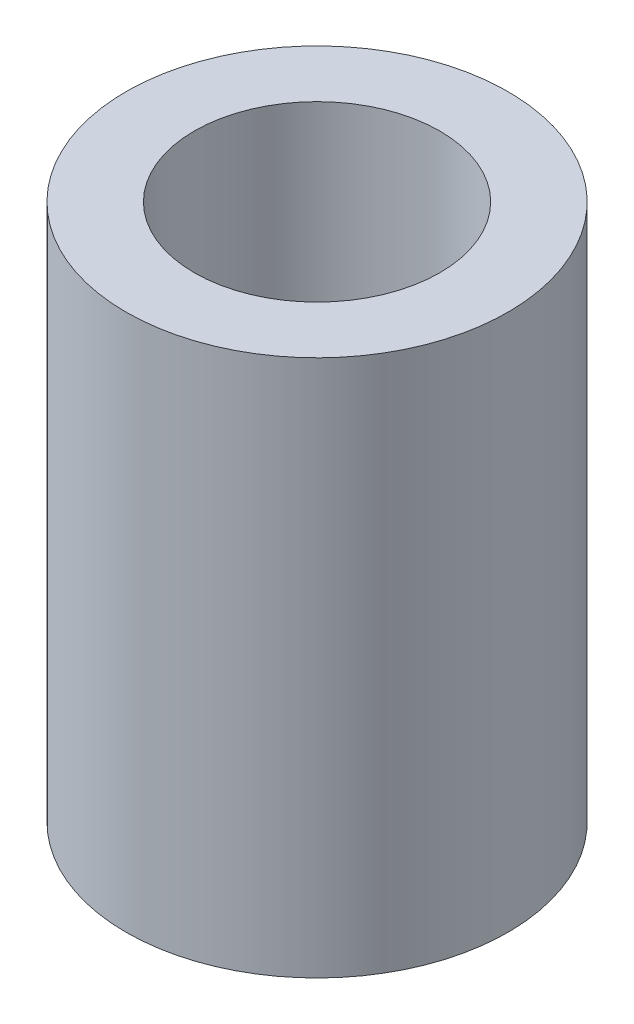
ISO-10303-21;
HEADER;
FILE_DESCRIPTION(('STEP AP214'),'2;1');
FILE_NAME('part.step','',(''),(''),'','','');
FILE_SCHEMA(('AUTOMOTIVE_DESIGN { 1 0 10303 214 1 1 1 1 }'));
ENDSEC;
DATA;
#1=APPLICATION_CONTEXT('core data for automotive mechanical design processes');
#2=APPLICATION_PROTOCOL_DEFINITION('international standard','automotive_design',2000,#1);
#3=PRODUCT_CONTEXT('',#1,'mechanical');
#4=PRODUCT('Part','Part','',(#3));
#5=PRODUCT_RELATED_PRODUCT_CATEGORY('part','',(#4));
#6=PRODUCT_DEFINITION_FORMATION('','',#4);
#7=PRODUCT_DEFINITION_CONTEXT('part definition',#1,'design');
#8=PRODUCT_DEFINITION('design','',#6,#7);
#9=PRODUCT_DEFINITION_SHAPE('','',#8);
#10=(LENGTH_UNIT() NAMED_UNIT(*) SI_UNIT(.MILLI.,.METRE.));
#11=(NAMED_UNIT(*) PLANE_ANGLE_UNIT() SI_UNIT($,.RADIAN.));
#12=(NAMED_UNIT(*) SI_UNIT($,.STERADIAN.) SOLID_ANGLE_UNIT());
#13=UNCERTAINTY_MEASURE_WITH_UNIT(LENGTH_MEASURE(1.E-05),#10,'distance_accuracy_value','');
#14=(GEOMETRIC_REPRESENTATION_CONTEXT(3) GLOBAL_UNCERTAINTY_ASSIGNED_CONTEXT((#13)) GLOBAL_UNIT_ASSIGNED_CONTEXT((#10,
#11,#12)) REPRESENTATION_CONTEXT('',''));
#15=CARTESIAN_POINT('',(0.,0.,0.));
#16=DIRECTION('',(0.,0.,1.));
#17=DIRECTION('',(1.,0.,0.));
#18=AXIS2_PLACEMENT_3D('',#15,#16,#17);
#19=CARTESIAN_POINT('',(0.,10.,0.));
#20=DIRECTION('',(0.,-1.,0.));
#21=DIRECTION('',(0.,0.,-1.));
#22=AXIS2_PLACEMENT_3D('',#19,#20,#21);
#23=CYLINDRICAL_SURFACE('',#22,3.556);
#24=CARTESIAN_POINT('',(0.,10.,0.));
#25=DIRECTION('',(0.,1.,0.));
#26=DIRECTION('',(0.,0.,1.));
#27=AXIS2_PLACEMENT_3D('',#24,#25,#26);
#28=CIRCLE('',#27,3.556);
#29=CARTESIAN_POINT('',(0.,10.,3.556));
#30=VERTEX_POINT('',#29);
#31=EDGE_CURVE('E10',#30,#30,#28,.T.);
#32=ORIENTED_EDGE('',*,*,#31,.F.);
#33=EDGE_LOOP('',(#32));
#34=FACE_BOUND('',#33,.T.);
#35=CARTESIAN_POINT('',(0.,0.,0.));
#36=DIRECTION('',(0.,1.,0.));
#37=DIRECTION('',(0.,0.,1.));
#38=AXIS2_PLACEMENT_3D('',#35,#36,#37);
#39=CIRCLE('',#38,3.556);
#40=CARTESIAN_POINT('',(0.,0.,3.556));
#41=VERTEX_POINT('',#40);
#42=EDGE_CURVE('E34',#41,#41,#39,.T.);
#43=ORIENTED_EDGE('',*,*,#42,.T.);
#44=EDGE_LOOP('',(#43));
#45=FACE_BOUND('',#44,.T.);
#46=ADVANCED_FACE('F31',(#34,#45),#23,.T.);
#47=CARTESIAN_POINT('',(0.,10.,0.));
#48=DIRECTION('',(0.,1.,0.));
#49=DIRECTION('',(0.,0.,1.));
#50=AXIS2_PLACEMENT_3D('',#47,#48,#49);
#51=PLANE('',#50);
#52=CARTESIAN_POINT('',(0.,10.,0.));
#53=DIRECTION('',(0.,1.,0.));
#54=DIRECTION('',(0.,0.,1.));
#55=AXIS2_PLACEMENT_3D('',#52,#53,#54);
#56=CIRCLE('',#55,2.286);
#57=CARTESIAN_POINT('',(0.,10.,2.286));
#58=VERTEX_POINT('',#57);
#59=EDGE_CURVE('E43',#58,#58,#56,.T.);
#60=ORIENTED_EDGE('',*,*,#59,.F.);
#61=EDGE_LOOP('',(#60));
#62=FACE_BOUND('',#61,.T.);
#63=ORIENTED_EDGE('',*,*,#31,.T.);
#64=EDGE_LOOP('',(#63));
#65=FACE_BOUND('',#64,.T.);
#66=ADVANCED_FACE('F58',(#62,#65),#51,.T.);
#67=CARTESIAN_POINT('',(0.,0.,0.));
#68=DIRECTION('',(0.,1.,0.));
#69=DIRECTION('',(0.,0.,1.));
#70=AXIS2_PLACEMENT_3D('',#67,#68,#69);
#71=PLANE('',#70);
#72=ORIENTED_EDGE('',*,*,#42,.F.);
#73=EDGE_LOOP('',(#72));
#74=FACE_BOUND('',#73,.T.);
#75=ADVANCED_FACE('F54',(#74),#71,.F.);
#76=CARTESIAN_POINT('',(0.,2.5,0.));
#77=DIRECTION('',(0.,1.,0.));
#78=DIRECTION('',(0.,0.,1.));
#79=AXIS2_PLACEMENT_3D('',#76,#77,#78);
#80=CYLINDRICAL_SURFACE('',#79,2.286);
#81=CARTESIAN_POINT('',(0.,2.5,0.));
#82=DIRECTION('',(0.,1.,0.));
#83=DIRECTION('',(0.,0.,1.));
#84=AXIS2_PLACEMENT_3D('',#81,#82,#83);
#85=CIRCLE('',#84,2.286);
#86=CARTESIAN_POINT('',(0.,2.5,2.286));
#87=VERTEX_POINT('',#86);
#88=EDGE_CURVE('E41',#87,#87,#85,.T.);
#89=ORIENTED_EDGE('',*,*,#88,.F.);
#90=EDGE_LOOP('',(#89));
#91=FACE_BOUND('',#90,.T.);
#92=ORIENTED_EDGE('',*,*,#59,.T.);
#93=EDGE_LOOP('',(#92));
#94=FACE_BOUND('',#93,.T.);
#95=ADVANCED_FACE('F51',(#91,#94),#80,.F.);
#96=CARTESIAN_POINT('',(0.,2.5,0.));
#97=DIRECTION('',(0.,1.,0.));
#98=DIRECTION('',(0.,0.,1.));
#99=AXIS2_PLACEMENT_3D('',#96,#97,#98);
#100=PLANE('',#99);
#101=ORIENTED_EDGE('',*,*,#88,.T.);
#102=EDGE_LOOP('',(#101));
#103=FACE_BOUND('',#102,.T.);
#104=ADVANCED_FACE('F49',(#103),#100,.T.);
#105=CLOSED_SHELL('',(#46,#66,#75,#95,#104));
#106=MANIFOLD_SOLID_BREP('B2',#105);
#107=ADVANCED_BREP_SHAPE_REPRESENTATION('',(#18,#106),#14);
#108=SHAPE_DEFINITION_REPRESENTATION(#9,#107);
ENDSEC;
END-ISO-10303-21;
